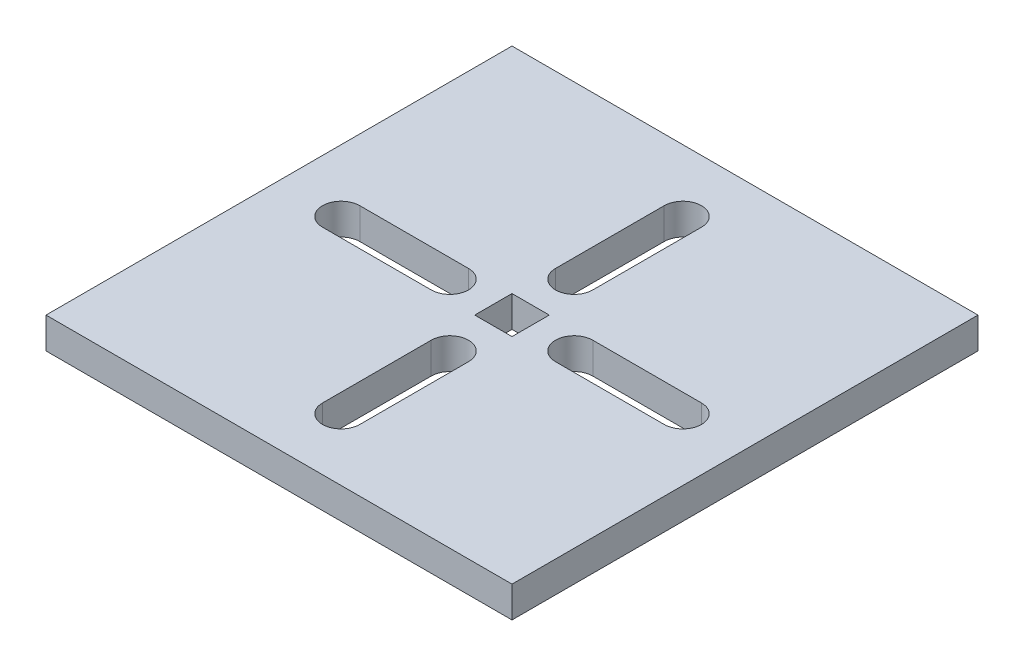
ISO-10303-21;
HEADER;
FILE_DESCRIPTION(('STEP AP214'),'2;1');
FILE_NAME('part.step','',(''),(''),'','','');
FILE_SCHEMA(('AUTOMOTIVE_DESIGN { 1 0 10303 214 1 1 1 1 }'));
ENDSEC;
DATA;
#1=APPLICATION_CONTEXT('core data for automotive mechanical design processes');
#2=APPLICATION_PROTOCOL_DEFINITION('international standard','automotive_design',2000,#1);
#3=PRODUCT_CONTEXT('',#1,'mechanical');
#4=PRODUCT('Part','Part','',(#3));
#5=PRODUCT_RELATED_PRODUCT_CATEGORY('part','',(#4));
#6=PRODUCT_DEFINITION_FORMATION('','',#4);
#7=PRODUCT_DEFINITION_CONTEXT('part definition',#1,'design');
#8=PRODUCT_DEFINITION('design','',#6,#7);
#9=PRODUCT_DEFINITION_SHAPE('','',#8);
#10=(LENGTH_UNIT() NAMED_UNIT(*) SI_UNIT(.MILLI.,.METRE.));
#11=(NAMED_UNIT(*) PLANE_ANGLE_UNIT() SI_UNIT($,.RADIAN.));
#12=(NAMED_UNIT(*) SI_UNIT($,.STERADIAN.) SOLID_ANGLE_UNIT());
#13=UNCERTAINTY_MEASURE_WITH_UNIT(LENGTH_MEASURE(1.E-05),#10,'distance_accuracy_value','');
#14=(GEOMETRIC_REPRESENTATION_CONTEXT(3) GLOBAL_UNCERTAINTY_ASSIGNED_CONTEXT((#13)) GLOBAL_UNIT_ASSIGNED_CONTEXT((#10,
#11,#12)) REPRESENTATION_CONTEXT('',''));
#15=CARTESIAN_POINT('',(0.,0.,0.));
#16=DIRECTION('',(0.,0.,1.));
#17=DIRECTION('',(1.,0.,0.));
#18=AXIS2_PLACEMENT_3D('',#15,#16,#17);
#19=CARTESIAN_POINT('',(75.0000000000455,10.,-75.0000000000455));
#20=DIRECTION('',(-1.,0.,0.));
#21=DIRECTION('',(0.,0.,1.));
#22=AXIS2_PLACEMENT_3D('',#19,#20,#21);
#23=PLANE('',#22);
#24=DIRECTION('',(0.,0.,-1.));
#25=VECTOR('',#24,1.);
#26=CARTESIAN_POINT('',(75.0000000000455,0.,-75.0000000000455));
#27=LINE('',#26,#25);
#28=CARTESIAN_POINT('',(75.0000000000455,0.,75.0000000000455));
#29=VERTEX_POINT('',#28);
#30=CARTESIAN_POINT('',(75.0000000000455,0.,-75.0000000000455));
#31=VERTEX_POINT('',#30);
#32=EDGE_CURVE('E352',#29,#31,#27,.T.);
#33=ORIENTED_EDGE('',*,*,#32,.T.);
#34=DIRECTION('',(0.,-1.,0.));
#35=VECTOR('',#34,1.);
#36=CARTESIAN_POINT('',(75.0000000000455,10.,-75.0000000000455));
#37=LINE('',#36,#35);
#38=CARTESIAN_POINT('',(75.0000000000455,10.,-75.0000000000455));
#39=VERTEX_POINT('',#38);
#40=EDGE_CURVE('E11',#39,#31,#37,.T.);
#41=ORIENTED_EDGE('',*,*,#40,.F.);
#42=DIRECTION('',(0.,0.,-1.));
#43=VECTOR('',#42,1.);
#44=CARTESIAN_POINT('',(75.0000000000455,10.,-75.0000000000455));
#45=LINE('',#44,#43);
#46=CARTESIAN_POINT('',(75.0000000000455,10.,75.0000000000455));
#47=VERTEX_POINT('',#46);
#48=EDGE_CURVE('E359',#47,#39,#45,.T.);
#49=ORIENTED_EDGE('',*,*,#48,.F.);
#50=DIRECTION('',(0.,-1.,0.));
#51=VECTOR('',#50,1.);
#52=CARTESIAN_POINT('',(75.0000000000455,10.,75.0000000000455));
#53=LINE('',#52,#51);
#54=EDGE_CURVE('E369',#47,#29,#53,.T.);
#55=ORIENTED_EDGE('',*,*,#54,.T.);
#56=EDGE_LOOP('',(#33,#41,#49,#55));
#57=FACE_BOUND('',#56,.T.);
#58=ADVANCED_FACE('F32',(#57),#23,.F.);
#59=CARTESIAN_POINT('',(-75.0000000000455,10.,-75.0000000000455));
#60=DIRECTION('',(0.,0.,1.));
#61=DIRECTION('',(1.,0.,0.));
#62=AXIS2_PLACEMENT_3D('',#59,#60,#61);
#63=PLANE('',#62);
#64=DIRECTION('',(-1.,0.,0.));
#65=VECTOR('',#64,1.);
#66=CARTESIAN_POINT('',(-75.0000000000455,0.,-75.0000000000455));
#67=LINE('',#66,#65);
#68=CARTESIAN_POINT('',(-75.0000000000455,0.,-75.0000000000455));
#69=VERTEX_POINT('',#68);
#70=EDGE_CURVE('E372',#31,#69,#67,.T.);
#71=ORIENTED_EDGE('',*,*,#70,.T.);
#72=DIRECTION('',(0.,-1.,0.));
#73=VECTOR('',#72,1.);
#74=CARTESIAN_POINT('',(-75.0000000000455,10.,-75.0000000000455));
#75=LINE('',#74,#73);
#76=CARTESIAN_POINT('',(-75.0000000000455,10.,-75.0000000000455));
#77=VERTEX_POINT('',#76);
#78=EDGE_CURVE('E39',#77,#69,#75,.T.);
#79=ORIENTED_EDGE('',*,*,#78,.F.);
#80=DIRECTION('',(-1.,0.,0.));
#81=VECTOR('',#80,1.);
#82=CARTESIAN_POINT('',(-75.0000000000455,10.,-75.0000000000455));
#83=LINE('',#82,#81);
#84=EDGE_CURVE('E362',#39,#77,#83,.T.);
#85=ORIENTED_EDGE('',*,*,#84,.F.);
#86=ORIENTED_EDGE('',*,*,#40,.T.);
#87=EDGE_LOOP('',(#71,#79,#85,#86));
#88=FACE_BOUND('',#87,.T.);
#89=ADVANCED_FACE('F401',(#88),#63,.F.);
#90=CARTESIAN_POINT('',(-75.0000000000455,10.,-75.0000000000455));
#91=DIRECTION('',(1.,0.,0.));
#92=DIRECTION('',(0.,0.,-1.));
#93=AXIS2_PLACEMENT_3D('',#90,#91,#92);
#94=PLANE('',#93);
#95=DIRECTION('',(0.,0.,1.));
#96=VECTOR('',#95,1.);
#97=CARTESIAN_POINT('',(-75.0000000000455,0.,-75.0000000000455));
#98=LINE('',#97,#96);
#99=CARTESIAN_POINT('',(-75.0000000000455,0.,75.0000000000455));
#100=VERTEX_POINT('',#99);
#101=EDGE_CURVE('E374',#69,#100,#98,.T.);
#102=ORIENTED_EDGE('',*,*,#101,.T.);
#103=DIRECTION('',(0.,-1.,0.));
#104=VECTOR('',#103,1.);
#105=CARTESIAN_POINT('',(-75.0000000000455,10.,75.0000000000455));
#106=LINE('',#105,#104);
#107=CARTESIAN_POINT('',(-75.0000000000455,10.,75.0000000000455));
#108=VERTEX_POINT('',#107);
#109=EDGE_CURVE('E379',#108,#100,#106,.T.);
#110=ORIENTED_EDGE('',*,*,#109,.F.);
#111=DIRECTION('',(0.,0.,1.));
#112=VECTOR('',#111,1.);
#113=CARTESIAN_POINT('',(-75.0000000000455,10.,-75.0000000000455));
#114=LINE('',#113,#112);
#115=EDGE_CURVE('E365',#77,#108,#114,.T.);
#116=ORIENTED_EDGE('',*,*,#115,.F.);
#117=ORIENTED_EDGE('',*,*,#78,.T.);
#118=EDGE_LOOP('',(#102,#110,#116,#117));
#119=FACE_BOUND('',#118,.T.);
#120=ADVANCED_FACE('F386',(#119),#94,.F.);
#121=CARTESIAN_POINT('',(-75.0000000000455,10.,75.0000000000455));
#122=DIRECTION('',(0.,0.,-1.));
#123=DIRECTION('',(-1.,0.,0.));
#124=AXIS2_PLACEMENT_3D('',#121,#122,#123);
#125=PLANE('',#124);
#126=DIRECTION('',(1.,0.,0.));
#127=VECTOR('',#126,1.);
#128=CARTESIAN_POINT('',(-75.0000000000455,0.,75.0000000000455));
#129=LINE('',#128,#127);
#130=EDGE_CURVE('E363',#100,#29,#129,.T.);
#131=ORIENTED_EDGE('',*,*,#130,.T.);
#132=ORIENTED_EDGE('',*,*,#54,.F.);
#133=DIRECTION('',(1.,0.,0.));
#134=VECTOR('',#133,1.);
#135=CARTESIAN_POINT('',(-75.0000000000455,10.,75.0000000000455));
#136=LINE('',#135,#134);
#137=EDGE_CURVE('E367',#108,#47,#136,.T.);
#138=ORIENTED_EDGE('',*,*,#137,.F.);
#139=ORIENTED_EDGE('',*,*,#109,.T.);
#140=EDGE_LOOP('',(#131,#132,#138,#139));
#141=FACE_BOUND('',#140,.T.);
#142=ADVANCED_FACE('F395',(#141),#125,.F.);
#143=CARTESIAN_POINT('',(0.,10.,0.));
#144=DIRECTION('',(0.,1.,0.));
#145=DIRECTION('',(0.,0.,1.));
#146=AXIS2_PLACEMENT_3D('',#143,#144,#145);
#147=PLANE('',#146);
#148=CARTESIAN_POINT('',(-20.,10.,0.));
#149=DIRECTION('',(0.,1.,0.));
#150=DIRECTION('',(0.,0.,-1.));
#151=AXIS2_PLACEMENT_3D('',#148,#149,#150);
#152=CIRCLE('',#151,6.);
#153=CARTESIAN_POINT('',(-20.,10.,6.));
#154=VERTEX_POINT('',#153);
#155=CARTESIAN_POINT('',(-20.,10.,-6.));
#156=VERTEX_POINT('',#155);
#157=EDGE_CURVE('E46',#154,#156,#152,.T.);
#158=ORIENTED_EDGE('',*,*,#157,.F.);
#159=DIRECTION('',(1.,0.,0.));
#160=VECTOR('',#159,1.);
#161=CARTESIAN_POINT('',(-20.,10.,6.));
#162=LINE('',#161,#160);
#163=CARTESIAN_POINT('',(-55.,10.,6.));
#164=VERTEX_POINT('',#163);
#165=EDGE_CURVE('E217',#164,#154,#162,.T.);
#166=ORIENTED_EDGE('',*,*,#165,.F.);
#167=CARTESIAN_POINT('',(-55.,10.,0.));
#168=DIRECTION('',(0.,1.,0.));
#169=DIRECTION('',(0.,0.,-1.));
#170=AXIS2_PLACEMENT_3D('',#167,#168,#169);
#171=CIRCLE('',#170,6.);
#172=CARTESIAN_POINT('',(-55.,10.,-6.));
#173=VERTEX_POINT('',#172);
#174=EDGE_CURVE('E209',#173,#164,#171,.T.);
#175=ORIENTED_EDGE('',*,*,#174,.F.);
#176=DIRECTION('',(-1.,0.,0.));
#177=VECTOR('',#176,1.);
#178=CARTESIAN_POINT('',(-20.,10.,-6.));
#179=LINE('',#178,#177);
#180=EDGE_CURVE('E196',#156,#173,#179,.T.);
#181=ORIENTED_EDGE('',*,*,#180,.F.);
#182=EDGE_LOOP('',(#158,#166,#175,#181));
#183=FACE_BOUND('',#182,.T.);
#184=CARTESIAN_POINT('',(2.09488880330588E-13,10.,-20.));
#185=DIRECTION('',(0.,1.,0.));
#186=DIRECTION('',(1.,0.,0.));
#187=AXIS2_PLACEMENT_3D('',#184,#185,#186);
#188=CIRCLE('',#187,6.);
#189=CARTESIAN_POINT('',(-5.99999999999979,10.,-20.0000000000001));
#190=VERTEX_POINT('',#189);
#191=CARTESIAN_POINT('',(6.00000000000021,10.,-19.9999999999999));
#192=VERTEX_POINT('',#191);
#193=EDGE_CURVE('E54',#190,#192,#188,.T.);
#194=ORIENTED_EDGE('',*,*,#193,.F.);
#195=DIRECTION('',(0.,0.,1.));
#196=VECTOR('',#195,1.);
#197=CARTESIAN_POINT('',(-5.99999999999979,10.,-20.0000000000001));
#198=LINE('',#197,#196);
#199=CARTESIAN_POINT('',(-5.99999999999942,10.,-55.0000000000001));
#200=VERTEX_POINT('',#199);
#201=EDGE_CURVE('E253',#200,#190,#198,.T.);
#202=ORIENTED_EDGE('',*,*,#201,.F.);
#203=CARTESIAN_POINT('',(5.76094420909117E-13,10.,-55.));
#204=DIRECTION('',(0.,1.,0.));
#205=DIRECTION('',(1.,0.,0.));
#206=AXIS2_PLACEMENT_3D('',#203,#204,#205);
#207=CIRCLE('',#206,6.);
#208=CARTESIAN_POINT('',(6.00000000000058,10.,-54.9999999999999));
#209=VERTEX_POINT('',#208);
#210=EDGE_CURVE('E245',#209,#200,#207,.T.);
#211=ORIENTED_EDGE('',*,*,#210,.F.);
#212=DIRECTION('',(0.,0.,-1.));
#213=VECTOR('',#212,1.);
#214=CARTESIAN_POINT('',(6.00000000000021,10.,-19.9999999999999));
#215=LINE('',#214,#213);
#216=EDGE_CURVE('E235',#192,#209,#215,.T.);
#217=ORIENTED_EDGE('',*,*,#216,.F.);
#218=EDGE_LOOP('',(#194,#202,#211,#217));
#219=FACE_BOUND('',#218,.T.);
#220=CARTESIAN_POINT('',(0.,10.,20.));
#221=DIRECTION('',(0.,1.,0.));
#222=DIRECTION('',(-1.,0.,0.));
#223=AXIS2_PLACEMENT_3D('',#220,#221,#222);
#224=CIRCLE('',#223,6.);
#225=CARTESIAN_POINT('',(5.99999999999993,10.,20.));
#226=VERTEX_POINT('',#225);
#227=CARTESIAN_POINT('',(-6.00000000000007,10.,20.));
#228=VERTEX_POINT('',#227);
#229=EDGE_CURVE('E289',#226,#228,#224,.T.);
#230=ORIENTED_EDGE('',*,*,#229,.F.);
#231=DIRECTION('',(0.,0.,-1.));
#232=VECTOR('',#231,1.);
#233=CARTESIAN_POINT('',(5.99999999999993,10.,20.));
#234=LINE('',#233,#232);
#235=CARTESIAN_POINT('',(5.99999999999981,10.,55.));
#236=VERTEX_POINT('',#235);
#237=EDGE_CURVE('E281',#236,#226,#234,.T.);
#238=ORIENTED_EDGE('',*,*,#237,.F.);
#239=CARTESIAN_POINT('',(-1.92031473636372E-13,10.,55.));
#240=DIRECTION('',(0.,1.,0.));
#241=DIRECTION('',(-1.,0.,0.));
#242=AXIS2_PLACEMENT_3D('',#239,#240,#241);
#243=CIRCLE('',#242,6.);
#244=CARTESIAN_POINT('',(-6.00000000000019,10.,55.));
#245=VERTEX_POINT('',#244);
#246=EDGE_CURVE('E273',#245,#236,#243,.T.);
#247=ORIENTED_EDGE('',*,*,#246,.F.);
#248=DIRECTION('',(0.,0.,1.));
#249=VECTOR('',#248,1.);
#250=CARTESIAN_POINT('',(-6.00000000000007,10.,20.));
#251=LINE('',#250,#249);
#252=EDGE_CURVE('E234',#228,#245,#251,.T.);
#253=ORIENTED_EDGE('',*,*,#252,.F.);
#254=EDGE_LOOP('',(#230,#238,#247,#253));
#255=FACE_BOUND('',#254,.T.);
#256=CARTESIAN_POINT('',(20.,10.,0.));
#257=DIRECTION('',(0.,1.,0.));
#258=DIRECTION('',(0.,0.,1.));
#259=AXIS2_PLACEMENT_3D('',#256,#257,#258);
#260=CIRCLE('',#259,6.);
#261=CARTESIAN_POINT('',(20.,10.,-6.));
#262=VERTEX_POINT('',#261);
#263=CARTESIAN_POINT('',(20.,10.,6.));
#264=VERTEX_POINT('',#263);
#265=EDGE_CURVE('E294',#262,#264,#260,.T.);
#266=ORIENTED_EDGE('',*,*,#265,.F.);
#267=DIRECTION('',(-1.,0.,0.));
#268=VECTOR('',#267,1.);
#269=CARTESIAN_POINT('',(20.,10.,-6.));
#270=LINE('',#269,#268);
#271=CARTESIAN_POINT('',(55.,10.,-6.));
#272=VERTEX_POINT('',#271);
#273=EDGE_CURVE('E299',#272,#262,#270,.T.);
#274=ORIENTED_EDGE('',*,*,#273,.F.);
#275=CARTESIAN_POINT('',(55.,10.,0.));
#276=DIRECTION('',(0.,1.,0.));
#277=DIRECTION('',(0.,0.,1.));
#278=AXIS2_PLACEMENT_3D('',#275,#276,#277);
#279=CIRCLE('',#278,6.);
#280=CARTESIAN_POINT('',(55.,10.,6.));
#281=VERTEX_POINT('',#280);
#282=EDGE_CURVE('E313',#281,#272,#279,.T.);
#283=ORIENTED_EDGE('',*,*,#282,.F.);
#284=DIRECTION('',(1.,0.,0.));
#285=VECTOR('',#284,1.);
#286=CARTESIAN_POINT('',(20.,10.,6.));
#287=LINE('',#286,#285);
#288=EDGE_CURVE('E310',#264,#281,#287,.T.);
#289=ORIENTED_EDGE('',*,*,#288,.F.);
#290=EDGE_LOOP('',(#266,#274,#283,#289));
#291=FACE_BOUND('',#290,.T.);
#292=DIRECTION('',(0.,0.,-1.));
#293=VECTOR('',#292,1.);
#294=CARTESIAN_POINT('',(6.,10.,-6.));
#295=LINE('',#294,#293);
#296=CARTESIAN_POINT('',(6.,10.,6.));
#297=VERTEX_POINT('',#296);
#298=CARTESIAN_POINT('',(6.,10.,-6.));
#299=VERTEX_POINT('',#298);
#300=EDGE_CURVE('E320',#297,#299,#295,.T.);
#301=ORIENTED_EDGE('',*,*,#300,.F.);
#302=DIRECTION('',(1.,0.,0.));
#303=VECTOR('',#302,1.);
#304=CARTESIAN_POINT('',(-6.,10.,6.));
#305=LINE('',#304,#303);
#306=CARTESIAN_POINT('',(-6.,10.,6.));
#307=VERTEX_POINT('',#306);
#308=EDGE_CURVE('E331',#307,#297,#305,.T.);
#309=ORIENTED_EDGE('',*,*,#308,.F.);
#310=DIRECTION('',(0.,0.,1.));
#311=VECTOR('',#310,1.);
#312=CARTESIAN_POINT('',(-6.,10.,-6.));
#313=LINE('',#312,#311);
#314=CARTESIAN_POINT('',(-6.,10.,-6.));
#315=VERTEX_POINT('',#314);
#316=EDGE_CURVE('E345',#315,#307,#313,.T.);
#317=ORIENTED_EDGE('',*,*,#316,.F.);
#318=DIRECTION('',(-1.,0.,0.));
#319=VECTOR('',#318,1.);
#320=CARTESIAN_POINT('',(-6.,10.,-6.));
#321=LINE('',#320,#319);
#322=EDGE_CURVE('E342',#299,#315,#321,.T.);
#323=ORIENTED_EDGE('',*,*,#322,.F.);
#324=EDGE_LOOP('',(#301,#309,#317,#323));
#325=FACE_BOUND('',#324,.T.);
#326=ORIENTED_EDGE('',*,*,#48,.T.);
#327=ORIENTED_EDGE('',*,*,#84,.T.);
#328=ORIENTED_EDGE('',*,*,#115,.T.);
#329=ORIENTED_EDGE('',*,*,#137,.T.);
#330=EDGE_LOOP('',(#326,#327,#328,#329));
#331=FACE_BOUND('',#330,.T.);
#332=ADVANCED_FACE('F215',(#183,#219,#255,#291,#325,#331),#147,.T.);
#333=CARTESIAN_POINT('',(0.,0.,0.));
#334=DIRECTION('',(0.,1.,0.));
#335=DIRECTION('',(0.,0.,1.));
#336=AXIS2_PLACEMENT_3D('',#333,#334,#335);
#337=PLANE('',#336);
#338=DIRECTION('',(1.,0.,0.));
#339=VECTOR('',#338,1.);
#340=CARTESIAN_POINT('',(-20.,0.,6.));
#341=LINE('',#340,#339);
#342=CARTESIAN_POINT('',(-55.,0.,6.));
#343=VERTEX_POINT('',#342);
#344=CARTESIAN_POINT('',(-20.,0.,6.));
#345=VERTEX_POINT('',#344);
#346=EDGE_CURVE('E227',#343,#345,#341,.T.);
#347=ORIENTED_EDGE('',*,*,#346,.T.);
#348=CARTESIAN_POINT('',(-20.,0.,0.));
#349=DIRECTION('',(0.,1.,0.));
#350=DIRECTION('',(0.,0.,-1.));
#351=AXIS2_PLACEMENT_3D('',#348,#349,#350);
#352=CIRCLE('',#351,6.);
#353=CARTESIAN_POINT('',(-20.,0.,-6.));
#354=VERTEX_POINT('',#353);
#355=EDGE_CURVE('E231',#345,#354,#352,.T.);
#356=ORIENTED_EDGE('',*,*,#355,.T.);
#357=DIRECTION('',(-1.,0.,0.));
#358=VECTOR('',#357,1.);
#359=CARTESIAN_POINT('',(-20.,0.,-6.));
#360=LINE('',#359,#358);
#361=CARTESIAN_POINT('',(-55.,0.,-6.));
#362=VERTEX_POINT('',#361);
#363=EDGE_CURVE('E204',#354,#362,#360,.T.);
#364=ORIENTED_EDGE('',*,*,#363,.T.);
#365=CARTESIAN_POINT('',(-55.,0.,0.));
#366=DIRECTION('',(0.,1.,0.));
#367=DIRECTION('',(0.,0.,-1.));
#368=AXIS2_PLACEMENT_3D('',#365,#366,#367);
#369=CIRCLE('',#368,6.);
#370=EDGE_CURVE('E212',#362,#343,#369,.T.);
#371=ORIENTED_EDGE('',*,*,#370,.T.);
#372=EDGE_LOOP('',(#347,#356,#364,#371));
#373=FACE_BOUND('',#372,.T.);
#374=DIRECTION('',(0.,0.,1.));
#375=VECTOR('',#374,1.);
#376=CARTESIAN_POINT('',(-5.99999999999979,0.,-20.0000000000001));
#377=LINE('',#376,#375);
#378=CARTESIAN_POINT('',(-5.99999999999942,0.,-55.0000000000001));
#379=VERTEX_POINT('',#378);
#380=CARTESIAN_POINT('',(-5.99999999999979,0.,-20.0000000000001));
#381=VERTEX_POINT('',#380);
#382=EDGE_CURVE('E257',#379,#381,#377,.T.);
#383=ORIENTED_EDGE('',*,*,#382,.T.);
#384=CARTESIAN_POINT('',(2.09488880330588E-13,0.,-20.));
#385=DIRECTION('',(0.,1.,0.));
#386=DIRECTION('',(1.,0.,0.));
#387=AXIS2_PLACEMENT_3D('',#384,#385,#386);
#388=CIRCLE('',#387,6.);
#389=CARTESIAN_POINT('',(6.00000000000021,0.,-19.9999999999999));
#390=VERTEX_POINT('',#389);
#391=EDGE_CURVE('E205',#381,#390,#388,.T.);
#392=ORIENTED_EDGE('',*,*,#391,.T.);
#393=DIRECTION('',(0.,0.,-1.));
#394=VECTOR('',#393,1.);
#395=CARTESIAN_POINT('',(6.00000000000021,0.,-19.9999999999999));
#396=LINE('',#395,#394);
#397=CARTESIAN_POINT('',(6.00000000000058,0.,-54.9999999999999));
#398=VERTEX_POINT('',#397);
#399=EDGE_CURVE('E237',#390,#398,#396,.T.);
#400=ORIENTED_EDGE('',*,*,#399,.T.);
#401=CARTESIAN_POINT('',(5.76094420909117E-13,0.,-55.));
#402=DIRECTION('',(0.,1.,0.));
#403=DIRECTION('',(1.,0.,0.));
#404=AXIS2_PLACEMENT_3D('',#401,#402,#403);
#405=CIRCLE('',#404,6.);
#406=EDGE_CURVE('E250',#398,#379,#405,.T.);
#407=ORIENTED_EDGE('',*,*,#406,.T.);
#408=EDGE_LOOP('',(#383,#392,#400,#407));
#409=FACE_BOUND('',#408,.T.);
#410=DIRECTION('',(0.,0.,-1.));
#411=VECTOR('',#410,1.);
#412=CARTESIAN_POINT('',(5.99999999999993,0.,20.));
#413=LINE('',#412,#411);
#414=CARTESIAN_POINT('',(5.99999999999981,0.,55.));
#415=VERTEX_POINT('',#414);
#416=CARTESIAN_POINT('',(5.99999999999993,0.,20.));
#417=VERTEX_POINT('',#416);
#418=EDGE_CURVE('E286',#415,#417,#413,.T.);
#419=ORIENTED_EDGE('',*,*,#418,.T.);
#420=CARTESIAN_POINT('',(0.,0.,20.));
#421=DIRECTION('',(0.,1.,0.));
#422=DIRECTION('',(-1.,0.,0.));
#423=AXIS2_PLACEMENT_3D('',#420,#421,#422);
#424=CIRCLE('',#423,6.);
#425=CARTESIAN_POINT('',(-6.00000000000007,0.,20.));
#426=VERTEX_POINT('',#425);
#427=EDGE_CURVE('E291',#417,#426,#424,.T.);
#428=ORIENTED_EDGE('',*,*,#427,.T.);
#429=DIRECTION('',(0.,0.,1.));
#430=VECTOR('',#429,1.);
#431=CARTESIAN_POINT('',(-6.00000000000007,0.,20.));
#432=LINE('',#431,#430);
#433=CARTESIAN_POINT('',(-6.00000000000019,0.,55.));
#434=VERTEX_POINT('',#433);
#435=EDGE_CURVE('E264',#426,#434,#432,.T.);
#436=ORIENTED_EDGE('',*,*,#435,.T.);
#437=CARTESIAN_POINT('',(-1.92031473636372E-13,0.,55.));
#438=DIRECTION('',(0.,1.,0.));
#439=DIRECTION('',(-1.,0.,0.));
#440=AXIS2_PLACEMENT_3D('',#437,#438,#439);
#441=CIRCLE('',#440,6.);
#442=EDGE_CURVE('E278',#434,#415,#441,.T.);
#443=ORIENTED_EDGE('',*,*,#442,.T.);
#444=EDGE_LOOP('',(#419,#428,#436,#443));
#445=FACE_BOUND('',#444,.T.);
#446=DIRECTION('',(-1.,0.,0.));
#447=VECTOR('',#446,1.);
#448=CARTESIAN_POINT('',(20.,0.,-6.));
#449=LINE('',#448,#447);
#450=CARTESIAN_POINT('',(55.,0.,-6.));
#451=VERTEX_POINT('',#450);
#452=CARTESIAN_POINT('',(20.,0.,-6.));
#453=VERTEX_POINT('',#452);
#454=EDGE_CURVE('E305',#451,#453,#449,.T.);
#455=ORIENTED_EDGE('',*,*,#454,.T.);
#456=CARTESIAN_POINT('',(20.,0.,0.));
#457=DIRECTION('',(0.,1.,0.));
#458=DIRECTION('',(0.,0.,1.));
#459=AXIS2_PLACEMENT_3D('',#456,#457,#458);
#460=CIRCLE('',#459,6.);
#461=CARTESIAN_POINT('',(20.,0.,6.));
#462=VERTEX_POINT('',#461);
#463=EDGE_CURVE('E295',#453,#462,#460,.T.);
#464=ORIENTED_EDGE('',*,*,#463,.T.);
#465=DIRECTION('',(1.,0.,0.));
#466=VECTOR('',#465,1.);
#467=CARTESIAN_POINT('',(20.,0.,6.));
#468=LINE('',#467,#466);
#469=CARTESIAN_POINT('',(55.,0.,6.));
#470=VERTEX_POINT('',#469);
#471=EDGE_CURVE('E298',#462,#470,#468,.T.);
#472=ORIENTED_EDGE('',*,*,#471,.T.);
#473=CARTESIAN_POINT('',(55.,0.,0.));
#474=DIRECTION('',(0.,1.,0.));
#475=DIRECTION('',(0.,0.,1.));
#476=AXIS2_PLACEMENT_3D('',#473,#474,#475);
#477=CIRCLE('',#476,6.);
#478=EDGE_CURVE('E302',#470,#451,#477,.T.);
#479=ORIENTED_EDGE('',*,*,#478,.T.);
#480=EDGE_LOOP('',(#455,#464,#472,#479));
#481=FACE_BOUND('',#480,.T.);
#482=DIRECTION('',(1.,0.,0.));
#483=VECTOR('',#482,1.);
#484=CARTESIAN_POINT('',(-6.,0.,6.));
#485=LINE('',#484,#483);
#486=CARTESIAN_POINT('',(-6.,0.,6.));
#487=VERTEX_POINT('',#486);
#488=CARTESIAN_POINT('',(6.,0.,6.));
#489=VERTEX_POINT('',#488);
#490=EDGE_CURVE('E337',#487,#489,#485,.T.);
#491=ORIENTED_EDGE('',*,*,#490,.T.);
#492=DIRECTION('',(0.,0.,-1.));
#493=VECTOR('',#492,1.);
#494=CARTESIAN_POINT('',(6.,0.,-6.));
#495=LINE('',#494,#493);
#496=CARTESIAN_POINT('',(6.,0.,-6.));
#497=VERTEX_POINT('',#496);
#498=EDGE_CURVE('E327',#489,#497,#495,.T.);
#499=ORIENTED_EDGE('',*,*,#498,.T.);
#500=DIRECTION('',(-1.,0.,0.));
#501=VECTOR('',#500,1.);
#502=CARTESIAN_POINT('',(-6.,0.,-6.));
#503=LINE('',#502,#501);
#504=CARTESIAN_POINT('',(-6.,0.,-6.));
#505=VERTEX_POINT('',#504);
#506=EDGE_CURVE('E330',#497,#505,#503,.T.);
#507=ORIENTED_EDGE('',*,*,#506,.T.);
#508=DIRECTION('',(0.,0.,1.));
#509=VECTOR('',#508,1.);
#510=CARTESIAN_POINT('',(-6.,0.,-6.));
#511=LINE('',#510,#509);
#512=EDGE_CURVE('E334',#505,#487,#511,.T.);
#513=ORIENTED_EDGE('',*,*,#512,.T.);
#514=EDGE_LOOP('',(#491,#499,#507,#513));
#515=FACE_BOUND('',#514,.T.);
#516=ORIENTED_EDGE('',*,*,#32,.F.);
#517=ORIENTED_EDGE('',*,*,#130,.F.);
#518=ORIENTED_EDGE('',*,*,#101,.F.);
#519=ORIENTED_EDGE('',*,*,#70,.F.);
#520=EDGE_LOOP('',(#516,#517,#518,#519));
#521=FACE_BOUND('',#520,.T.);
#522=ADVANCED_FACE('F392',(#373,#409,#445,#481,#515,#521),#337,.F.);
#523=CARTESIAN_POINT('',(6.,0.,-6.));
#524=DIRECTION('',(1.,0.,0.));
#525=DIRECTION('',(0.,0.,-1.));
#526=AXIS2_PLACEMENT_3D('',#523,#524,#525);
#527=PLANE('',#526);
#528=ORIENTED_EDGE('',*,*,#300,.T.);
#529=DIRECTION('',(0.,1.,0.));
#530=VECTOR('',#529,1.);
#531=CARTESIAN_POINT('',(6.,0.,-6.));
#532=LINE('',#531,#530);
#533=EDGE_CURVE('E340',#497,#299,#532,.T.);
#534=ORIENTED_EDGE('',*,*,#533,.F.);
#535=ORIENTED_EDGE('',*,*,#498,.F.);
#536=DIRECTION('',(0.,1.,0.));
#537=VECTOR('',#536,1.);
#538=CARTESIAN_POINT('',(6.,0.,6.));
#539=LINE('',#538,#537);
#540=EDGE_CURVE('E350',#489,#297,#539,.T.);
#541=ORIENTED_EDGE('',*,*,#540,.T.);
#542=EDGE_LOOP('',(#528,#534,#535,#541));
#543=FACE_BOUND('',#542,.T.);
#544=ADVANCED_FACE('F413',(#543),#527,.F.);
#545=CARTESIAN_POINT('',(-6.,0.,6.));
#546=DIRECTION('',(0.,0.,1.));
#547=DIRECTION('',(1.,0.,0.));
#548=AXIS2_PLACEMENT_3D('',#545,#546,#547);
#549=PLANE('',#548);
#550=ORIENTED_EDGE('',*,*,#308,.T.);
#551=ORIENTED_EDGE('',*,*,#540,.F.);
#552=ORIENTED_EDGE('',*,*,#490,.F.);
#553=DIRECTION('',(0.,1.,0.));
#554=VECTOR('',#553,1.);
#555=CARTESIAN_POINT('',(-6.,0.,6.));
#556=LINE('',#555,#554);
#557=EDGE_CURVE('E353',#487,#307,#556,.T.);
#558=ORIENTED_EDGE('',*,*,#557,.T.);
#559=EDGE_LOOP('',(#550,#551,#552,#558));
#560=FACE_BOUND('',#559,.T.);
#561=ADVANCED_FACE('F419',(#560),#549,.F.);
#562=CARTESIAN_POINT('',(-6.,0.,-6.));
#563=DIRECTION('',(-1.,0.,0.));
#564=DIRECTION('',(0.,0.,1.));
#565=AXIS2_PLACEMENT_3D('',#562,#563,#564);
#566=PLANE('',#565);
#567=ORIENTED_EDGE('',*,*,#316,.T.);
#568=ORIENTED_EDGE('',*,*,#557,.F.);
#569=ORIENTED_EDGE('',*,*,#512,.F.);
#570=DIRECTION('',(0.,1.,0.));
#571=VECTOR('',#570,1.);
#572=CARTESIAN_POINT('',(-6.,0.,-6.));
#573=LINE('',#572,#571);
#574=EDGE_CURVE('E355',#505,#315,#573,.T.);
#575=ORIENTED_EDGE('',*,*,#574,.T.);
#576=EDGE_LOOP('',(#567,#568,#569,#575));
#577=FACE_BOUND('',#576,.T.);
#578=ADVANCED_FACE('F425',(#577),#566,.F.);
#579=CARTESIAN_POINT('',(-6.,0.,-6.));
#580=DIRECTION('',(0.,0.,-1.));
#581=DIRECTION('',(-1.,0.,0.));
#582=AXIS2_PLACEMENT_3D('',#579,#580,#581);
#583=PLANE('',#582);
#584=ORIENTED_EDGE('',*,*,#322,.T.);
#585=ORIENTED_EDGE('',*,*,#574,.F.);
#586=ORIENTED_EDGE('',*,*,#506,.F.);
#587=ORIENTED_EDGE('',*,*,#533,.T.);
#588=EDGE_LOOP('',(#584,#585,#586,#587));
#589=FACE_BOUND('',#588,.T.);
#590=ADVANCED_FACE('F421',(#589),#583,.F.);
#591=CARTESIAN_POINT('',(20.,0.,0.));
#592=DIRECTION('',(0.,1.,0.));
#593=DIRECTION('',(0.,0.,1.));
#594=AXIS2_PLACEMENT_3D('',#591,#592,#593);
#595=CYLINDRICAL_SURFACE('',#594,6.);
#596=ORIENTED_EDGE('',*,*,#265,.T.);
#597=DIRECTION('',(0.,1.,0.));
#598=VECTOR('',#597,1.);
#599=CARTESIAN_POINT('',(20.,0.,6.));
#600=LINE('',#599,#598);
#601=EDGE_CURVE('E308',#462,#264,#600,.T.);
#602=ORIENTED_EDGE('',*,*,#601,.F.);
#603=ORIENTED_EDGE('',*,*,#463,.F.);
#604=DIRECTION('',(0.,1.,0.));
#605=VECTOR('',#604,1.);
#606=CARTESIAN_POINT('',(20.,0.,-6.));
#607=LINE('',#606,#605);
#608=EDGE_CURVE('E318',#453,#262,#607,.T.);
#609=ORIENTED_EDGE('',*,*,#608,.T.);
#610=EDGE_LOOP('',(#596,#602,#603,#609));
#611=FACE_BOUND('',#610,.T.);
#612=ADVANCED_FACE('F424',(#611),#595,.F.);
#613=CARTESIAN_POINT('',(20.,0.,-6.));
#614=DIRECTION('',(0.,0.,-1.));
#615=DIRECTION('',(-1.,0.,0.));
#616=AXIS2_PLACEMENT_3D('',#613,#614,#615);
#617=PLANE('',#616);
#618=ORIENTED_EDGE('',*,*,#273,.T.);
#619=ORIENTED_EDGE('',*,*,#608,.F.);
#620=ORIENTED_EDGE('',*,*,#454,.F.);
#621=DIRECTION('',(0.,1.,0.));
#622=VECTOR('',#621,1.);
#623=CARTESIAN_POINT('',(55.,0.,-6.));
#624=LINE('',#623,#622);
#625=EDGE_CURVE('E321',#451,#272,#624,.T.);
#626=ORIENTED_EDGE('',*,*,#625,.T.);
#627=EDGE_LOOP('',(#618,#619,#620,#626));
#628=FACE_BOUND('',#627,.T.);
#629=ADVANCED_FACE('F435',(#628),#617,.F.);
#630=CARTESIAN_POINT('',(55.,0.,0.));
#631=DIRECTION('',(0.,1.,0.));
#632=DIRECTION('',(0.,0.,1.));
#633=AXIS2_PLACEMENT_3D('',#630,#631,#632);
#634=CYLINDRICAL_SURFACE('',#633,6.);
#635=ORIENTED_EDGE('',*,*,#282,.T.);
#636=ORIENTED_EDGE('',*,*,#625,.F.);
#637=ORIENTED_EDGE('',*,*,#478,.F.);
#638=DIRECTION('',(0.,1.,0.));
#639=VECTOR('',#638,1.);
#640=CARTESIAN_POINT('',(55.,0.,6.));
#641=LINE('',#640,#639);
#642=EDGE_CURVE('E323',#470,#281,#641,.T.);
#643=ORIENTED_EDGE('',*,*,#642,.T.);
#644=EDGE_LOOP('',(#635,#636,#637,#643));
#645=FACE_BOUND('',#644,.T.);
#646=ADVANCED_FACE('F441',(#645),#634,.F.);
#647=CARTESIAN_POINT('',(20.,0.,6.));
#648=DIRECTION('',(0.,0.,1.));
#649=DIRECTION('',(1.,0.,0.));
#650=AXIS2_PLACEMENT_3D('',#647,#648,#649);
#651=PLANE('',#650);
#652=ORIENTED_EDGE('',*,*,#288,.T.);
#653=ORIENTED_EDGE('',*,*,#642,.F.);
#654=ORIENTED_EDGE('',*,*,#471,.F.);
#655=ORIENTED_EDGE('',*,*,#601,.T.);
#656=EDGE_LOOP('',(#652,#653,#654,#655));
#657=FACE_BOUND('',#656,.T.);
#658=ADVANCED_FACE('F437',(#657),#651,.F.);
#659=CARTESIAN_POINT('',(0.,0.,20.));
#660=DIRECTION('',(0.,1.,0.));
#661=DIRECTION('',(-1.,0.,0.));
#662=AXIS2_PLACEMENT_3D('',#659,#660,#661);
#663=CYLINDRICAL_SURFACE('',#662,6.);
#664=ORIENTED_EDGE('',*,*,#229,.T.);
#665=DIRECTION('',(0.,1.,0.));
#666=VECTOR('',#665,1.);
#667=CARTESIAN_POINT('',(-6.00000000000007,0.,20.));
#668=LINE('',#667,#666);
#669=EDGE_CURVE('E270',#426,#228,#668,.T.);
#670=ORIENTED_EDGE('',*,*,#669,.F.);
#671=ORIENTED_EDGE('',*,*,#427,.F.);
#672=DIRECTION('',(0.,1.,0.));
#673=VECTOR('',#672,1.);
#674=CARTESIAN_POINT('',(5.99999999999993,0.,20.));
#675=LINE('',#674,#673);
#676=EDGE_CURVE('E283',#417,#226,#675,.T.);
#677=ORIENTED_EDGE('',*,*,#676,.T.);
#678=EDGE_LOOP('',(#664,#670,#671,#677));
#679=FACE_BOUND('',#678,.T.);
#680=ADVANCED_FACE('F440',(#679),#663,.F.);
#681=CARTESIAN_POINT('',(5.99999999999993,0.,20.));
#682=DIRECTION('',(1.,0.,0.));
#683=DIRECTION('',(0.,0.,-1.));
#684=AXIS2_PLACEMENT_3D('',#681,#682,#683);
#685=PLANE('',#684);
#686=ORIENTED_EDGE('',*,*,#237,.T.);
#687=ORIENTED_EDGE('',*,*,#676,.F.);
#688=ORIENTED_EDGE('',*,*,#418,.F.);
#689=DIRECTION('',(0.,1.,0.));
#690=VECTOR('',#689,1.);
#691=CARTESIAN_POINT('',(5.99999999999981,0.,55.));
#692=LINE('',#691,#690);
#693=EDGE_CURVE('E275',#415,#236,#692,.T.);
#694=ORIENTED_EDGE('',*,*,#693,.T.);
#695=EDGE_LOOP('',(#686,#687,#688,#694));
#696=FACE_BOUND('',#695,.T.);
#697=ADVANCED_FACE('F451',(#696),#685,.F.);
#698=CARTESIAN_POINT('',(-1.92031473636372E-13,0.,55.));
#699=DIRECTION('',(0.,1.,0.));
#700=DIRECTION('',(-1.,0.,0.));
#701=AXIS2_PLACEMENT_3D('',#698,#699,#700);
#702=CYLINDRICAL_SURFACE('',#701,6.);
#703=ORIENTED_EDGE('',*,*,#246,.T.);
#704=ORIENTED_EDGE('',*,*,#693,.F.);
#705=ORIENTED_EDGE('',*,*,#442,.F.);
#706=DIRECTION('',(0.,1.,0.));
#707=VECTOR('',#706,1.);
#708=CARTESIAN_POINT('',(-6.00000000000019,0.,55.));
#709=LINE('',#708,#707);
#710=EDGE_CURVE('E267',#434,#245,#709,.T.);
#711=ORIENTED_EDGE('',*,*,#710,.T.);
#712=EDGE_LOOP('',(#703,#704,#705,#711));
#713=FACE_BOUND('',#712,.T.);
#714=ADVANCED_FACE('F455',(#713),#702,.F.);
#715=CARTESIAN_POINT('',(-6.00000000000007,0.,20.));
#716=DIRECTION('',(-1.,0.,0.));
#717=DIRECTION('',(0.,0.,1.));
#718=AXIS2_PLACEMENT_3D('',#715,#716,#717);
#719=PLANE('',#718);
#720=ORIENTED_EDGE('',*,*,#252,.T.);
#721=ORIENTED_EDGE('',*,*,#710,.F.);
#722=ORIENTED_EDGE('',*,*,#435,.F.);
#723=ORIENTED_EDGE('',*,*,#669,.T.);
#724=EDGE_LOOP('',(#720,#721,#722,#723));
#725=FACE_BOUND('',#724,.T.);
#726=ADVANCED_FACE('F459',(#725),#719,.F.);
#727=CARTESIAN_POINT('',(2.09488880330588E-13,0.,-20.));
#728=DIRECTION('',(0.,1.,0.));
#729=DIRECTION('',(1.,0.,0.));
#730=AXIS2_PLACEMENT_3D('',#727,#728,#729);
#731=CYLINDRICAL_SURFACE('',#730,6.);
#732=ORIENTED_EDGE('',*,*,#193,.T.);
#733=DIRECTION('',(0.,1.,0.));
#734=VECTOR('',#733,1.);
#735=CARTESIAN_POINT('',(6.00000000000021,0.,-19.9999999999999));
#736=LINE('',#735,#734);
#737=EDGE_CURVE('E243',#390,#192,#736,.T.);
#738=ORIENTED_EDGE('',*,*,#737,.F.);
#739=ORIENTED_EDGE('',*,*,#391,.F.);
#740=DIRECTION('',(0.,1.,0.));
#741=VECTOR('',#740,1.);
#742=CARTESIAN_POINT('',(-5.99999999999979,0.,-20.0000000000001));
#743=LINE('',#742,#741);
#744=EDGE_CURVE('E255',#381,#190,#743,.T.);
#745=ORIENTED_EDGE('',*,*,#744,.T.);
#746=EDGE_LOOP('',(#732,#738,#739,#745));
#747=FACE_BOUND('',#746,.T.);
#748=ADVANCED_FACE('F463',(#747),#731,.F.);
#749=CARTESIAN_POINT('',(-5.99999999999979,0.,-20.0000000000001));
#750=DIRECTION('',(-1.,0.,0.));
#751=DIRECTION('',(0.,0.,1.));
#752=AXIS2_PLACEMENT_3D('',#749,#750,#751);
#753=PLANE('',#752);
#754=ORIENTED_EDGE('',*,*,#201,.T.);
#755=ORIENTED_EDGE('',*,*,#744,.F.);
#756=ORIENTED_EDGE('',*,*,#382,.F.);
#757=DIRECTION('',(0.,1.,0.));
#758=VECTOR('',#757,1.);
#759=CARTESIAN_POINT('',(-5.99999999999942,0.,-55.0000000000001));
#760=LINE('',#759,#758);
#761=EDGE_CURVE('E247',#379,#200,#760,.T.);
#762=ORIENTED_EDGE('',*,*,#761,.T.);
#763=EDGE_LOOP('',(#754,#755,#756,#762));
#764=FACE_BOUND('',#763,.T.);
#765=ADVANCED_FACE('F467',(#764),#753,.F.);
#766=CARTESIAN_POINT('',(5.76094420909117E-13,0.,-55.));
#767=DIRECTION('',(0.,1.,0.));
#768=DIRECTION('',(1.,0.,0.));
#769=AXIS2_PLACEMENT_3D('',#766,#767,#768);
#770=CYLINDRICAL_SURFACE('',#769,6.);
#771=ORIENTED_EDGE('',*,*,#210,.T.);
#772=ORIENTED_EDGE('',*,*,#761,.F.);
#773=ORIENTED_EDGE('',*,*,#406,.F.);
#774=DIRECTION('',(0.,1.,0.));
#775=VECTOR('',#774,1.);
#776=CARTESIAN_POINT('',(6.00000000000058,0.,-54.9999999999999));
#777=LINE('',#776,#775);
#778=EDGE_CURVE('E240',#398,#209,#777,.T.);
#779=ORIENTED_EDGE('',*,*,#778,.T.);
#780=EDGE_LOOP('',(#771,#772,#773,#779));
#781=FACE_BOUND('',#780,.T.);
#782=ADVANCED_FACE('F470',(#781),#770,.F.);
#783=CARTESIAN_POINT('',(6.00000000000021,0.,-19.9999999999999));
#784=DIRECTION('',(1.,0.,0.));
#785=DIRECTION('',(0.,0.,-1.));
#786=AXIS2_PLACEMENT_3D('',#783,#784,#785);
#787=PLANE('',#786);
#788=ORIENTED_EDGE('',*,*,#216,.T.);
#789=ORIENTED_EDGE('',*,*,#778,.F.);
#790=ORIENTED_EDGE('',*,*,#399,.F.);
#791=ORIENTED_EDGE('',*,*,#737,.T.);
#792=EDGE_LOOP('',(#788,#789,#790,#791));
#793=FACE_BOUND('',#792,.T.);
#794=ADVANCED_FACE('F474',(#793),#787,.F.);
#795=CARTESIAN_POINT('',(-20.,0.,0.));
#796=DIRECTION('',(0.,1.,0.));
#797=DIRECTION('',(0.,0.,-1.));
#798=AXIS2_PLACEMENT_3D('',#795,#796,#797);
#799=CYLINDRICAL_SURFACE('',#798,6.);
#800=ORIENTED_EDGE('',*,*,#157,.T.);
#801=DIRECTION('',(0.,1.,0.));
#802=VECTOR('',#801,1.);
#803=CARTESIAN_POINT('',(-20.,0.,-6.));
#804=LINE('',#803,#802);
#805=EDGE_CURVE('E201',#354,#156,#804,.T.);
#806=ORIENTED_EDGE('',*,*,#805,.F.);
#807=ORIENTED_EDGE('',*,*,#355,.F.);
#808=DIRECTION('',(0.,1.,0.));
#809=VECTOR('',#808,1.);
#810=CARTESIAN_POINT('',(-20.,0.,6.));
#811=LINE('',#810,#809);
#812=EDGE_CURVE('E225',#345,#154,#811,.T.);
#813=ORIENTED_EDGE('',*,*,#812,.T.);
#814=EDGE_LOOP('',(#800,#806,#807,#813));
#815=FACE_BOUND('',#814,.T.);
#816=ADVANCED_FACE('F478',(#815),#799,.F.);
#817=CARTESIAN_POINT('',(-20.,0.,6.));
#818=DIRECTION('',(0.,0.,1.));
#819=DIRECTION('',(1.,0.,0.));
#820=AXIS2_PLACEMENT_3D('',#817,#818,#819);
#821=PLANE('',#820);
#822=ORIENTED_EDGE('',*,*,#165,.T.);
#823=ORIENTED_EDGE('',*,*,#812,.F.);
#824=ORIENTED_EDGE('',*,*,#346,.F.);
#825=DIRECTION('',(0.,1.,0.));
#826=VECTOR('',#825,1.);
#827=CARTESIAN_POINT('',(-55.,0.,6.));
#828=LINE('',#827,#826);
#829=EDGE_CURVE('E218',#343,#164,#828,.T.);
#830=ORIENTED_EDGE('',*,*,#829,.T.);
#831=EDGE_LOOP('',(#822,#823,#824,#830));
#832=FACE_BOUND('',#831,.T.);
#833=ADVANCED_FACE('F482',(#832),#821,.F.);
#834=CARTESIAN_POINT('',(-55.,0.,0.));
#835=DIRECTION('',(0.,1.,0.));
#836=DIRECTION('',(0.,0.,-1.));
#837=AXIS2_PLACEMENT_3D('',#834,#835,#836);
#838=CYLINDRICAL_SURFACE('',#837,6.);
#839=ORIENTED_EDGE('',*,*,#174,.T.);
#840=ORIENTED_EDGE('',*,*,#829,.F.);
#841=ORIENTED_EDGE('',*,*,#370,.F.);
#842=DIRECTION('',(0.,1.,0.));
#843=VECTOR('',#842,1.);
#844=CARTESIAN_POINT('',(-55.,0.,-6.));
#845=LINE('',#844,#843);
#846=EDGE_CURVE('E199',#362,#173,#845,.T.);
#847=ORIENTED_EDGE('',*,*,#846,.T.);
#848=EDGE_LOOP('',(#839,#840,#841,#847));
#849=FACE_BOUND('',#848,.T.);
#850=ADVANCED_FACE('F208',(#849),#838,.F.);
#851=CARTESIAN_POINT('',(-20.,0.,-6.));
#852=DIRECTION('',(0.,0.,-1.));
#853=DIRECTION('',(-1.,0.,0.));
#854=AXIS2_PLACEMENT_3D('',#851,#852,#853);
#855=PLANE('',#854);
#856=ORIENTED_EDGE('',*,*,#180,.T.);
#857=ORIENTED_EDGE('',*,*,#846,.F.);
#858=ORIENTED_EDGE('',*,*,#363,.F.);
#859=ORIENTED_EDGE('',*,*,#805,.T.);
#860=EDGE_LOOP('',(#856,#857,#858,#859));
#861=FACE_BOUND('',#860,.T.);
#862=ADVANCED_FACE('F198',(#861),#855,.F.);
#863=CLOSED_SHELL('',(#58,#89,#120,#142,#332,#522,#544,#561,#578,#590,#612,#629,#646,#658,#680,
#697,#714,#726,#748,#765,#782,#794,#816,#833,#850,#862));
#864=MANIFOLD_SOLID_BREP('B2',#863);
#865=ADVANCED_BREP_SHAPE_REPRESENTATION('',(#18,#864),#14);
#866=SHAPE_DEFINITION_REPRESENTATION(#9,#865);
ENDSEC;
END-ISO-10303-21;
